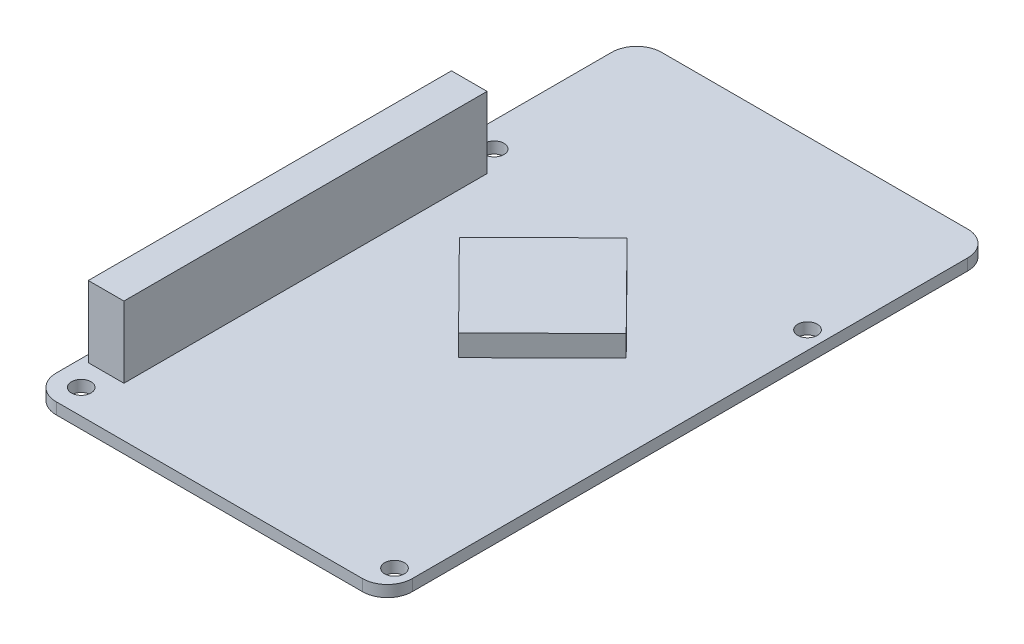
ISO-10303-21;
HEADER;
FILE_DESCRIPTION(('STEP AP214'),'2;1');
FILE_NAME('part.step','',(''),(''),'','','');
FILE_SCHEMA(('AUTOMOTIVE_DESIGN { 1 0 10303 214 1 1 1 1 }'));
ENDSEC;
DATA;
#1=APPLICATION_CONTEXT('core data for automotive mechanical design processes');
#2=APPLICATION_PROTOCOL_DEFINITION('international standard','automotive_design',2000,#1);
#3=PRODUCT_CONTEXT('',#1,'mechanical');
#4=PRODUCT('Part','Part','',(#3));
#5=PRODUCT_RELATED_PRODUCT_CATEGORY('part','',(#4));
#6=PRODUCT_DEFINITION_FORMATION('','',#4);
#7=PRODUCT_DEFINITION_CONTEXT('part definition',#1,'design');
#8=PRODUCT_DEFINITION('design','',#6,#7);
#9=PRODUCT_DEFINITION_SHAPE('','',#8);
#10=(LENGTH_UNIT() NAMED_UNIT(*) SI_UNIT(.MILLI.,.METRE.));
#11=(NAMED_UNIT(*) PLANE_ANGLE_UNIT() SI_UNIT($,.RADIAN.));
#12=(NAMED_UNIT(*) SI_UNIT($,.STERADIAN.) SOLID_ANGLE_UNIT());
#13=UNCERTAINTY_MEASURE_WITH_UNIT(LENGTH_MEASURE(1.E-05),#10,'distance_accuracy_value','');
#14=(GEOMETRIC_REPRESENTATION_CONTEXT(3) GLOBAL_UNCERTAINTY_ASSIGNED_CONTEXT((#13)) GLOBAL_UNIT_ASSIGNED_CONTEXT((#10,
#11,#12)) REPRESENTATION_CONTEXT('',''));
#15=CARTESIAN_POINT('',(0.,0.,0.));
#16=DIRECTION('',(0.,0.,1.));
#17=DIRECTION('',(1.,0.,0.));
#18=AXIS2_PLACEMENT_3D('',#15,#16,#17);
#19=CARTESIAN_POINT('',(0.,1.6,0.));
#20=DIRECTION('',(0.,-1.,0.));
#21=DIRECTION('',(0.,0.,-1.));
#22=AXIS2_PLACEMENT_3D('',#19,#20,#21);
#23=PLANE('',#22);
#24=DIRECTION('',(0.703505756727735,0.,0.710689559688995));
#25=VECTOR('',#24,1.);
#26=CARTESIAN_POINT('',(26.6484056100179,1.6,-57.0062030029917));
#27=LINE('',#26,#25);
#28=CARTESIAN_POINT('',(26.6484056100179,1.6,-57.0062030029917));
#29=VERTEX_POINT('',#28);
#30=CARTESIAN_POINT('',(38.2141461845933,1.6,-45.3223596259953));
#31=VERTEX_POINT('',#30);
#32=EDGE_CURVE('E55',#29,#31,#27,.T.);
#33=ORIENTED_EDGE('',*,*,#32,.T.);
#34=DIRECTION('',(-0.710689559688995,0.,0.703505756727735));
#35=VECTOR('',#34,1.);
#36=CARTESIAN_POINT('',(38.2141461845933,1.6,-45.3223596259953));
#37=LINE('',#36,#35);
#38=CARTESIAN_POINT('',(26.3838058780672,1.6,-33.61160294437));
#39=VERTEX_POINT('',#38);
#40=EDGE_CURVE('E188',#31,#39,#37,.T.);
#41=ORIENTED_EDGE('',*,*,#40,.T.);
#42=DIRECTION('',(0.703505756727735,0.,0.710689559688995));
#43=VECTOR('',#42,1.);
#44=CARTESIAN_POINT('',(14.8180653034918,1.6,-45.2954463213663));
#45=LINE('',#44,#43);
#46=CARTESIAN_POINT('',(14.8180653034918,1.6,-45.2954463213663));
#47=VERTEX_POINT('',#46);
#48=EDGE_CURVE('E170',#47,#39,#45,.T.);
#49=ORIENTED_EDGE('',*,*,#48,.F.);
#50=DIRECTION('',(-0.710689559688995,0.,0.703505756727735));
#51=VECTOR('',#50,1.);
#52=CARTESIAN_POINT('',(26.6484056100179,1.6,-57.0062030029917));
#53=LINE('',#52,#51);
#54=EDGE_CURVE('E60',#29,#47,#53,.T.);
#55=ORIENTED_EDGE('',*,*,#54,.F.);
#56=EDGE_LOOP('',(#33,#41,#49,#55));
#57=FACE_BOUND('',#56,.T.);
#58=CARTESIAN_POINT('',(3.5,1.6,-61.5));
#59=DIRECTION('',(0.,1.,0.));
#60=DIRECTION('',(0.,0.,1.));
#61=AXIS2_PLACEMENT_3D('',#58,#59,#60);
#62=CIRCLE('',#61,1.375);
#63=CARTESIAN_POINT('',(3.5,1.6,-60.125));
#64=VERTEX_POINT('',#63);
#65=EDGE_CURVE('E248',#64,#64,#62,.T.);
#66=ORIENTED_EDGE('',*,*,#65,.F.);
#67=EDGE_LOOP('',(#66));
#68=FACE_BOUND('',#67,.T.);
#69=CARTESIAN_POINT('',(47.5,1.6,-61.5));
#70=DIRECTION('',(0.,1.,0.));
#71=DIRECTION('',(0.,0.,1.));
#72=AXIS2_PLACEMENT_3D('',#69,#70,#71);
#73=CIRCLE('',#72,1.375);
#74=CARTESIAN_POINT('',(47.5,1.6,-60.125));
#75=VERTEX_POINT('',#74);
#76=EDGE_CURVE('E256',#75,#75,#73,.T.);
#77=ORIENTED_EDGE('',*,*,#76,.F.);
#78=EDGE_LOOP('',(#77));
#79=FACE_BOUND('',#78,.T.);
#80=CARTESIAN_POINT('',(47.5,1.6,-3.5));
#81=DIRECTION('',(0.,1.,0.));
#82=DIRECTION('',(0.,0.,1.));
#83=AXIS2_PLACEMENT_3D('',#80,#81,#82);
#84=CIRCLE('',#83,1.375);
#85=CARTESIAN_POINT('',(47.5,1.6,-2.125));
#86=VERTEX_POINT('',#85);
#87=EDGE_CURVE('E264',#86,#86,#84,.T.);
#88=ORIENTED_EDGE('',*,*,#87,.F.);
#89=EDGE_LOOP('',(#88));
#90=FACE_BOUND('',#89,.T.);
#91=CARTESIAN_POINT('',(3.5,1.6,-3.5));
#92=DIRECTION('',(0.,1.,0.));
#93=DIRECTION('',(0.,0.,1.));
#94=AXIS2_PLACEMENT_3D('',#91,#92,#93);
#95=CIRCLE('',#94,1.375);
#96=CARTESIAN_POINT('',(3.5,1.6,-2.125));
#97=VERTEX_POINT('',#96);
#98=EDGE_CURVE('E272',#97,#97,#95,.T.);
#99=ORIENTED_EDGE('',*,*,#98,.F.);
#100=EDGE_LOOP('',(#99));
#101=FACE_BOUND('',#100,.T.);
#102=DIRECTION('',(0.,0.,-1.));
#103=VECTOR('',#102,1.);
#104=CARTESIAN_POINT('',(50.,1.6,0.));
#105=LINE('',#104,#103);
#106=CARTESIAN_POINT('',(50.,1.6,-3.5));
#107=VERTEX_POINT('',#106);
#108=CARTESIAN_POINT('',(50.,1.6,-81.5));
#109=VERTEX_POINT('',#108);
#110=EDGE_CURVE('E289',#107,#109,#105,.T.);
#111=ORIENTED_EDGE('',*,*,#110,.T.);
#112=CARTESIAN_POINT('',(46.5,1.6,-81.5));
#113=DIRECTION('',(0.,-1.,0.));
#114=DIRECTION('',(0.,0.,-1.));
#115=AXIS2_PLACEMENT_3D('',#112,#113,#114);
#116=CIRCLE('',#115,3.5);
#117=CARTESIAN_POINT('',(46.5,1.6,-85.));
#118=VERTEX_POINT('',#117);
#119=EDGE_CURVE('E346',#109,#118,#116,.F.);
#120=ORIENTED_EDGE('',*,*,#119,.T.);
#121=DIRECTION('',(-1.,0.,0.));
#122=VECTOR('',#121,1.);
#123=CARTESIAN_POINT('',(0.,1.6,-85.));
#124=LINE('',#123,#122);
#125=CARTESIAN_POINT('',(3.5,1.6,-85.));
#126=VERTEX_POINT('',#125);
#127=EDGE_CURVE('E293',#118,#126,#124,.T.);
#128=ORIENTED_EDGE('',*,*,#127,.T.);
#129=CARTESIAN_POINT('',(3.5,1.6,-81.5));
#130=DIRECTION('',(0.,-1.,0.));
#131=DIRECTION('',(0.,0.,-1.));
#132=AXIS2_PLACEMENT_3D('',#129,#130,#131);
#133=CIRCLE('',#132,3.5);
#134=CARTESIAN_POINT('',(0.,1.6,-81.5));
#135=VERTEX_POINT('',#134);
#136=EDGE_CURVE('E343',#126,#135,#133,.F.);
#137=ORIENTED_EDGE('',*,*,#136,.T.);
#138=DIRECTION('',(0.,0.,1.));
#139=VECTOR('',#138,1.);
#140=CARTESIAN_POINT('',(0.,1.6,0.));
#141=LINE('',#140,#139);
#142=CARTESIAN_POINT('',(0.,1.6,-3.5));
#143=VERTEX_POINT('',#142);
#144=EDGE_CURVE('E280',#135,#143,#141,.T.);
#145=ORIENTED_EDGE('',*,*,#144,.T.);
#146=CARTESIAN_POINT('',(3.5,1.6,-3.5));
#147=DIRECTION('',(0.,-1.,0.));
#148=DIRECTION('',(0.,0.,-1.));
#149=AXIS2_PLACEMENT_3D('',#146,#147,#148);
#150=CIRCLE('',#149,3.5);
#151=CARTESIAN_POINT('',(3.5,1.6,0.));
#152=VERTEX_POINT('',#151);
#153=EDGE_CURVE('E340',#143,#152,#150,.F.);
#154=ORIENTED_EDGE('',*,*,#153,.T.);
#155=DIRECTION('',(1.,0.,0.));
#156=VECTOR('',#155,1.);
#157=CARTESIAN_POINT('',(0.,1.6,0.));
#158=LINE('',#157,#156);
#159=CARTESIAN_POINT('',(46.5,1.6,0.));
#160=VERTEX_POINT('',#159);
#161=EDGE_CURVE('E284',#152,#160,#158,.T.);
#162=ORIENTED_EDGE('',*,*,#161,.T.);
#163=CARTESIAN_POINT('',(46.5,1.6,-3.5));
#164=DIRECTION('',(0.,-1.,0.));
#165=DIRECTION('',(0.,0.,-1.));
#166=AXIS2_PLACEMENT_3D('',#163,#164,#165);
#167=CIRCLE('',#166,3.5);
#168=EDGE_CURVE('E337',#160,#107,#167,.F.);
#169=ORIENTED_EDGE('',*,*,#168,.T.);
#170=EDGE_LOOP('',(#111,#120,#128,#137,#145,#154,#162,#169));
#171=FACE_BOUND('',#170,.T.);
#172=DIRECTION('',(0.,0.,-1.));
#173=VECTOR('',#172,1.);
#174=CARTESIAN_POINT('',(6.,1.6,-7.00000000000001));
#175=LINE('',#174,#173);
#176=CARTESIAN_POINT('',(6.,1.6,-7.00000000000001));
#177=VERTEX_POINT('',#176);
#178=CARTESIAN_POINT('',(6.,1.6,-58.));
#179=VERTEX_POINT('',#178);
#180=EDGE_CURVE('E197',#177,#179,#175,.T.);
#181=ORIENTED_EDGE('',*,*,#180,.F.);
#182=DIRECTION('',(1.,0.,0.));
#183=VECTOR('',#182,1.);
#184=CARTESIAN_POINT('',(1.,1.6,-7.00000000000001));
#185=LINE('',#184,#183);
#186=CARTESIAN_POINT('',(1.,1.6,-7.00000000000001));
#187=VERTEX_POINT('',#186);
#188=EDGE_CURVE('E208',#187,#177,#185,.T.);
#189=ORIENTED_EDGE('',*,*,#188,.F.);
#190=DIRECTION('',(0.,0.,1.));
#191=VECTOR('',#190,1.);
#192=CARTESIAN_POINT('',(1.,1.6,-7.00000000000001));
#193=LINE('',#192,#191);
#194=CARTESIAN_POINT('',(1.,1.6,-58.));
#195=VERTEX_POINT('',#194);
#196=EDGE_CURVE('E225',#195,#187,#193,.T.);
#197=ORIENTED_EDGE('',*,*,#196,.F.);
#198=DIRECTION('',(-1.,0.,0.));
#199=VECTOR('',#198,1.);
#200=CARTESIAN_POINT('',(1.,1.6,-58.));
#201=LINE('',#200,#199);
#202=EDGE_CURVE('E221',#179,#195,#201,.T.);
#203=ORIENTED_EDGE('',*,*,#202,.F.);
#204=EDGE_LOOP('',(#181,#189,#197,#203));
#205=FACE_BOUND('',#204,.T.);
#206=ADVANCED_FACE('F39',(#57,#68,#79,#90,#101,#171,#205),#23,.F.);
#207=CARTESIAN_POINT('',(0.,0.,0.));
#208=DIRECTION('',(0.,-1.,0.));
#209=DIRECTION('',(0.,0.,-1.));
#210=AXIS2_PLACEMENT_3D('',#207,#208,#209);
#211=PLANE('',#210);
#212=CARTESIAN_POINT('',(47.5,0.,-61.5));
#213=DIRECTION('',(0.,1.,0.));
#214=DIRECTION('',(0.,0.,1.));
#215=AXIS2_PLACEMENT_3D('',#212,#213,#214);
#216=CIRCLE('',#215,1.375);
#217=CARTESIAN_POINT('',(47.5,0.,-60.125));
#218=VERTEX_POINT('',#217);
#219=EDGE_CURVE('E252',#218,#218,#216,.T.);
#220=ORIENTED_EDGE('',*,*,#219,.T.);
#221=EDGE_LOOP('',(#220));
#222=FACE_BOUND('',#221,.T.);
#223=CARTESIAN_POINT('',(3.5,0.,-3.5));
#224=DIRECTION('',(0.,1.,0.));
#225=DIRECTION('',(0.,0.,1.));
#226=AXIS2_PLACEMENT_3D('',#223,#224,#225);
#227=CIRCLE('',#226,1.375);
#228=CARTESIAN_POINT('',(3.5,0.,-2.125));
#229=VERTEX_POINT('',#228);
#230=EDGE_CURVE('E268',#229,#229,#227,.T.);
#231=ORIENTED_EDGE('',*,*,#230,.T.);
#232=EDGE_LOOP('',(#231));
#233=FACE_BOUND('',#232,.T.);
#234=DIRECTION('',(-1.,0.,0.));
#235=VECTOR('',#234,1.);
#236=CARTESIAN_POINT('',(0.,0.,-85.));
#237=LINE('',#236,#235);
#238=CARTESIAN_POINT('',(46.5,0.,-85.));
#239=VERTEX_POINT('',#238);
#240=CARTESIAN_POINT('',(3.5,0.,-85.));
#241=VERTEX_POINT('',#240);
#242=EDGE_CURVE('E285',#239,#241,#237,.T.);
#243=ORIENTED_EDGE('',*,*,#242,.F.);
#244=CARTESIAN_POINT('',(46.5,0.,-81.5));
#245=DIRECTION('',(0.,-1.,0.));
#246=DIRECTION('',(0.,0.,-1.));
#247=AXIS2_PLACEMENT_3D('',#244,#245,#246);
#248=CIRCLE('',#247,3.5);
#249=CARTESIAN_POINT('',(50.,0.,-81.5));
#250=VERTEX_POINT('',#249);
#251=EDGE_CURVE('E327',#239,#250,#248,.T.);
#252=ORIENTED_EDGE('',*,*,#251,.T.);
#253=DIRECTION('',(0.,0.,-1.));
#254=VECTOR('',#253,1.);
#255=CARTESIAN_POINT('',(50.,0.,0.));
#256=LINE('',#255,#254);
#257=CARTESIAN_POINT('',(50.,0.,-3.5));
#258=VERTEX_POINT('',#257);
#259=EDGE_CURVE('E305',#258,#250,#256,.T.);
#260=ORIENTED_EDGE('',*,*,#259,.F.);
#261=CARTESIAN_POINT('',(46.5,0.,-3.5));
#262=DIRECTION('',(0.,-1.,0.));
#263=DIRECTION('',(0.,0.,-1.));
#264=AXIS2_PLACEMENT_3D('',#261,#262,#263);
#265=CIRCLE('',#264,3.5);
#266=CARTESIAN_POINT('',(46.5,0.,0.));
#267=VERTEX_POINT('',#266);
#268=EDGE_CURVE('E318',#258,#267,#265,.T.);
#269=ORIENTED_EDGE('',*,*,#268,.T.);
#270=DIRECTION('',(1.,0.,0.));
#271=VECTOR('',#270,1.);
#272=CARTESIAN_POINT('',(0.,0.,0.));
#273=LINE('',#272,#271);
#274=CARTESIAN_POINT('',(3.5,0.,0.));
#275=VERTEX_POINT('',#274);
#276=EDGE_CURVE('E301',#275,#267,#273,.T.);
#277=ORIENTED_EDGE('',*,*,#276,.F.);
#278=CARTESIAN_POINT('',(3.5,0.,-3.5));
#279=DIRECTION('',(0.,-1.,0.));
#280=DIRECTION('',(0.,0.,-1.));
#281=AXIS2_PLACEMENT_3D('',#278,#279,#280);
#282=CIRCLE('',#281,3.5);
#283=CARTESIAN_POINT('',(0.,0.,-3.5));
#284=VERTEX_POINT('',#283);
#285=EDGE_CURVE('E321',#275,#284,#282,.T.);
#286=ORIENTED_EDGE('',*,*,#285,.T.);
#287=DIRECTION('',(0.,0.,1.));
#288=VECTOR('',#287,1.);
#289=CARTESIAN_POINT('',(0.,0.,0.));
#290=LINE('',#289,#288);
#291=CARTESIAN_POINT('',(0.,0.,-81.5));
#292=VERTEX_POINT('',#291);
#293=EDGE_CURVE('E276',#292,#284,#290,.T.);
#294=ORIENTED_EDGE('',*,*,#293,.F.);
#295=CARTESIAN_POINT('',(3.5,0.,-81.5));
#296=DIRECTION('',(0.,-1.,0.));
#297=DIRECTION('',(0.,0.,-1.));
#298=AXIS2_PLACEMENT_3D('',#295,#296,#297);
#299=CIRCLE('',#298,3.5);
#300=EDGE_CURVE('E324',#292,#241,#299,.T.);
#301=ORIENTED_EDGE('',*,*,#300,.T.);
#302=EDGE_LOOP('',(#243,#252,#260,#269,#277,#286,#294,#301));
#303=FACE_BOUND('',#302,.T.);
#304=CARTESIAN_POINT('',(47.5,0.,-3.5));
#305=DIRECTION('',(0.,1.,0.));
#306=DIRECTION('',(0.,0.,1.));
#307=AXIS2_PLACEMENT_3D('',#304,#305,#306);
#308=CIRCLE('',#307,1.375);
#309=CARTESIAN_POINT('',(47.5,0.,-2.125));
#310=VERTEX_POINT('',#309);
#311=EDGE_CURVE('E260',#310,#310,#308,.T.);
#312=ORIENTED_EDGE('',*,*,#311,.T.);
#313=EDGE_LOOP('',(#312));
#314=FACE_BOUND('',#313,.T.);
#315=CARTESIAN_POINT('',(3.5,0.,-61.5));
#316=DIRECTION('',(0.,1.,0.));
#317=DIRECTION('',(0.,0.,1.));
#318=AXIS2_PLACEMENT_3D('',#315,#316,#317);
#319=CIRCLE('',#318,1.375);
#320=CARTESIAN_POINT('',(3.5,0.,-60.125));
#321=VERTEX_POINT('',#320);
#322=EDGE_CURVE('E247',#321,#321,#319,.T.);
#323=ORIENTED_EDGE('',*,*,#322,.T.);
#324=EDGE_LOOP('',(#323));
#325=FACE_BOUND('',#324,.T.);
#326=ADVANCED_FACE('F375',(#222,#233,#303,#314,#325),#211,.T.);
#327=CARTESIAN_POINT('',(0.,1.6,0.));
#328=DIRECTION('',(1.,0.,0.));
#329=DIRECTION('',(0.,0.,-1.));
#330=AXIS2_PLACEMENT_3D('',#327,#328,#329);
#331=PLANE('',#330);
#332=ORIENTED_EDGE('',*,*,#144,.F.);
#333=DIRECTION('',(0.,-1.,0.));
#334=VECTOR('',#333,1.);
#335=CARTESIAN_POINT('',(0.,1.6,-81.5));
#336=LINE('',#335,#334);
#337=EDGE_CURVE('E352',#135,#292,#336,.T.);
#338=ORIENTED_EDGE('',*,*,#337,.T.);
#339=ORIENTED_EDGE('',*,*,#293,.T.);
#340=DIRECTION('',(0.,-1.,0.));
#341=VECTOR('',#340,1.);
#342=CARTESIAN_POINT('',(0.,1.6,-3.5));
#343=LINE('',#342,#341);
#344=EDGE_CURVE('E349',#284,#143,#343,.F.);
#345=ORIENTED_EDGE('',*,*,#344,.T.);
#346=EDGE_LOOP('',(#332,#338,#339,#345));
#347=FACE_BOUND('',#346,.T.);
#348=ADVANCED_FACE('F392',(#347),#331,.F.);
#349=CARTESIAN_POINT('',(0.,1.6,0.));
#350=DIRECTION('',(0.,0.,-1.));
#351=DIRECTION('',(-1.,0.,0.));
#352=AXIS2_PLACEMENT_3D('',#349,#350,#351);
#353=PLANE('',#352);
#354=ORIENTED_EDGE('',*,*,#161,.F.);
#355=DIRECTION('',(0.,-1.,0.));
#356=VECTOR('',#355,1.);
#357=CARTESIAN_POINT('',(3.5,1.6,0.));
#358=LINE('',#357,#356);
#359=EDGE_CURVE('E11',#152,#275,#358,.T.);
#360=ORIENTED_EDGE('',*,*,#359,.T.);
#361=ORIENTED_EDGE('',*,*,#276,.T.);
#362=DIRECTION('',(0.,-1.,0.));
#363=VECTOR('',#362,1.);
#364=CARTESIAN_POINT('',(46.5,1.6,0.));
#365=LINE('',#364,#363);
#366=EDGE_CURVE('E48',#267,#160,#365,.F.);
#367=ORIENTED_EDGE('',*,*,#366,.T.);
#368=EDGE_LOOP('',(#354,#360,#361,#367));
#369=FACE_BOUND('',#368,.T.);
#370=ADVANCED_FACE('F359',(#369),#353,.F.);
#371=CARTESIAN_POINT('',(50.,1.6,0.));
#372=DIRECTION('',(-1.,0.,0.));
#373=DIRECTION('',(0.,0.,1.));
#374=AXIS2_PLACEMENT_3D('',#371,#372,#373);
#375=PLANE('',#374);
#376=ORIENTED_EDGE('',*,*,#259,.T.);
#377=DIRECTION('',(0.,-1.,0.));
#378=VECTOR('',#377,1.);
#379=CARTESIAN_POINT('',(50.,1.6,-81.5));
#380=LINE('',#379,#378);
#381=EDGE_CURVE('E334',#250,#109,#380,.F.);
#382=ORIENTED_EDGE('',*,*,#381,.T.);
#383=ORIENTED_EDGE('',*,*,#110,.F.);
#384=DIRECTION('',(0.,-1.,0.));
#385=VECTOR('',#384,1.);
#386=CARTESIAN_POINT('',(50.,1.6,-3.5));
#387=LINE('',#386,#385);
#388=EDGE_CURVE('E330',#107,#258,#387,.T.);
#389=ORIENTED_EDGE('',*,*,#388,.T.);
#390=EDGE_LOOP('',(#376,#382,#383,#389));
#391=FACE_BOUND('',#390,.T.);
#392=ADVANCED_FACE('F371',(#391),#375,.F.);
#393=CARTESIAN_POINT('',(0.,1.6,-85.));
#394=DIRECTION('',(0.,0.,1.));
#395=DIRECTION('',(1.,0.,0.));
#396=AXIS2_PLACEMENT_3D('',#393,#394,#395);
#397=PLANE('',#396);
#398=ORIENTED_EDGE('',*,*,#127,.F.);
#399=DIRECTION('',(0.,-1.,0.));
#400=VECTOR('',#399,1.);
#401=CARTESIAN_POINT('',(46.5,1.6,-85.));
#402=LINE('',#401,#400);
#403=EDGE_CURVE('E314',#118,#239,#402,.T.);
#404=ORIENTED_EDGE('',*,*,#403,.T.);
#405=ORIENTED_EDGE('',*,*,#242,.T.);
#406=DIRECTION('',(0.,-1.,0.));
#407=VECTOR('',#406,1.);
#408=CARTESIAN_POINT('',(3.5,1.6,-85.));
#409=LINE('',#408,#407);
#410=EDGE_CURVE('E297',#241,#126,#409,.F.);
#411=ORIENTED_EDGE('',*,*,#410,.T.);
#412=EDGE_LOOP('',(#398,#404,#405,#411));
#413=FACE_BOUND('',#412,.T.);
#414=ADVANCED_FACE('F383',(#413),#397,.F.);
#415=CARTESIAN_POINT('',(3.5,1.6,-3.5));
#416=DIRECTION('',(0.,-1.,0.));
#417=DIRECTION('',(0.,0.,-1.));
#418=AXIS2_PLACEMENT_3D('',#415,#416,#417);
#419=CYLINDRICAL_SURFACE('',#418,1.375);
#420=ORIENTED_EDGE('',*,*,#98,.T.);
#421=EDGE_LOOP('',(#420));
#422=FACE_BOUND('',#421,.T.);
#423=ORIENTED_EDGE('',*,*,#230,.F.);
#424=EDGE_LOOP('',(#423));
#425=FACE_BOUND('',#424,.T.);
#426=ADVANCED_FACE('F412',(#422,#425),#419,.F.);
#427=CARTESIAN_POINT('',(47.5,1.6,-3.5));
#428=DIRECTION('',(0.,-1.,0.));
#429=DIRECTION('',(0.,0.,-1.));
#430=AXIS2_PLACEMENT_3D('',#427,#428,#429);
#431=CYLINDRICAL_SURFACE('',#430,1.375);
#432=ORIENTED_EDGE('',*,*,#87,.T.);
#433=EDGE_LOOP('',(#432));
#434=FACE_BOUND('',#433,.T.);
#435=ORIENTED_EDGE('',*,*,#311,.F.);
#436=EDGE_LOOP('',(#435));
#437=FACE_BOUND('',#436,.T.);
#438=ADVANCED_FACE('F434',(#434,#437),#431,.F.);
#439=CARTESIAN_POINT('',(47.5,1.6,-61.5));
#440=DIRECTION('',(0.,-1.,0.));
#441=DIRECTION('',(0.,0.,-1.));
#442=AXIS2_PLACEMENT_3D('',#439,#440,#441);
#443=CYLINDRICAL_SURFACE('',#442,1.375);
#444=ORIENTED_EDGE('',*,*,#76,.T.);
#445=EDGE_LOOP('',(#444));
#446=FACE_BOUND('',#445,.T.);
#447=ORIENTED_EDGE('',*,*,#219,.F.);
#448=EDGE_LOOP('',(#447));
#449=FACE_BOUND('',#448,.T.);
#450=ADVANCED_FACE('F428',(#446,#449),#443,.F.);
#451=CARTESIAN_POINT('',(3.5,1.6,-61.5));
#452=DIRECTION('',(0.,-1.,0.));
#453=DIRECTION('',(0.,0.,-1.));
#454=AXIS2_PLACEMENT_3D('',#451,#452,#453);
#455=CYLINDRICAL_SURFACE('',#454,1.375);
#456=ORIENTED_EDGE('',*,*,#65,.T.);
#457=EDGE_LOOP('',(#456));
#458=FACE_BOUND('',#457,.T.);
#459=ORIENTED_EDGE('',*,*,#322,.F.);
#460=EDGE_LOOP('',(#459));
#461=FACE_BOUND('',#460,.T.);
#462=ADVANCED_FACE('F424',(#458,#461),#455,.F.);
#463=CARTESIAN_POINT('',(46.5,1.6,-81.5));
#464=DIRECTION('',(0.,-1.,0.));
#465=DIRECTION('',(0.,0.,-1.));
#466=AXIS2_PLACEMENT_3D('',#463,#464,#465);
#467=CYLINDRICAL_SURFACE('',#466,3.5);
#468=ORIENTED_EDGE('',*,*,#119,.F.);
#469=ORIENTED_EDGE('',*,*,#381,.F.);
#470=ORIENTED_EDGE('',*,*,#251,.F.);
#471=ORIENTED_EDGE('',*,*,#403,.F.);
#472=EDGE_LOOP('',(#468,#469,#470,#471));
#473=FACE_BOUND('',#472,.T.);
#474=ADVANCED_FACE('F380',(#473),#467,.T.);
#475=CARTESIAN_POINT('',(3.5,1.6,-81.5));
#476=DIRECTION('',(0.,-1.,0.));
#477=DIRECTION('',(0.,0.,-1.));
#478=AXIS2_PLACEMENT_3D('',#475,#476,#477);
#479=CYLINDRICAL_SURFACE('',#478,3.5);
#480=ORIENTED_EDGE('',*,*,#136,.F.);
#481=ORIENTED_EDGE('',*,*,#410,.F.);
#482=ORIENTED_EDGE('',*,*,#300,.F.);
#483=ORIENTED_EDGE('',*,*,#337,.F.);
#484=EDGE_LOOP('',(#480,#481,#482,#483));
#485=FACE_BOUND('',#484,.T.);
#486=ADVANCED_FACE('F389',(#485),#479,.T.);
#487=CARTESIAN_POINT('',(3.5,1.6,-3.5));
#488=DIRECTION('',(0.,-1.,0.));
#489=DIRECTION('',(0.,0.,-1.));
#490=AXIS2_PLACEMENT_3D('',#487,#488,#489);
#491=CYLINDRICAL_SURFACE('',#490,3.5);
#492=ORIENTED_EDGE('',*,*,#153,.F.);
#493=ORIENTED_EDGE('',*,*,#344,.F.);
#494=ORIENTED_EDGE('',*,*,#285,.F.);
#495=ORIENTED_EDGE('',*,*,#359,.F.);
#496=EDGE_LOOP('',(#492,#493,#494,#495));
#497=FACE_BOUND('',#496,.T.);
#498=ADVANCED_FACE('F395',(#497),#491,.T.);
#499=CARTESIAN_POINT('',(46.5,1.6,-3.5));
#500=DIRECTION('',(0.,-1.,0.));
#501=DIRECTION('',(0.,0.,-1.));
#502=AXIS2_PLACEMENT_3D('',#499,#500,#501);
#503=CYLINDRICAL_SURFACE('',#502,3.5);
#504=ORIENTED_EDGE('',*,*,#168,.F.);
#505=ORIENTED_EDGE('',*,*,#366,.F.);
#506=ORIENTED_EDGE('',*,*,#268,.F.);
#507=ORIENTED_EDGE('',*,*,#388,.F.);
#508=EDGE_LOOP('',(#504,#505,#506,#507));
#509=FACE_BOUND('',#508,.T.);
#510=ADVANCED_FACE('F41',(#509),#503,.T.);
#511=CARTESIAN_POINT('',(6.,11.6,-7.00000000000001));
#512=DIRECTION('',(-1.,0.,0.));
#513=DIRECTION('',(0.,0.,1.));
#514=AXIS2_PLACEMENT_3D('',#511,#512,#513);
#515=PLANE('',#514);
#516=ORIENTED_EDGE('',*,*,#180,.T.);
#517=DIRECTION('',(0.,-1.,0.));
#518=VECTOR('',#517,1.);
#519=CARTESIAN_POINT('',(6.,11.6,-58.));
#520=LINE('',#519,#518);
#521=CARTESIAN_POINT('',(6.,11.6,-58.));
#522=VERTEX_POINT('',#521);
#523=EDGE_CURVE('E243',#522,#179,#520,.T.);
#524=ORIENTED_EDGE('',*,*,#523,.F.);
#525=DIRECTION('',(0.,0.,-1.));
#526=VECTOR('',#525,1.);
#527=CARTESIAN_POINT('',(6.,11.6,-7.00000000000001));
#528=LINE('',#527,#526);
#529=CARTESIAN_POINT('',(6.,11.6,-7.00000000000001));
#530=VERTEX_POINT('',#529);
#531=EDGE_CURVE('E203',#530,#522,#528,.T.);
#532=ORIENTED_EDGE('',*,*,#531,.F.);
#533=DIRECTION('',(0.,-1.,0.));
#534=VECTOR('',#533,1.);
#535=CARTESIAN_POINT('',(6.,11.6,-7.00000000000001));
#536=LINE('',#535,#534);
#537=EDGE_CURVE('E217',#530,#177,#536,.T.);
#538=ORIENTED_EDGE('',*,*,#537,.T.);
#539=EDGE_LOOP('',(#516,#524,#532,#538));
#540=FACE_BOUND('',#539,.T.);
#541=ADVANCED_FACE('F401',(#540),#515,.F.);
#542=CARTESIAN_POINT('',(1.,11.6,-58.));
#543=DIRECTION('',(0.,0.,1.));
#544=DIRECTION('',(1.,0.,0.));
#545=AXIS2_PLACEMENT_3D('',#542,#543,#544);
#546=PLANE('',#545);
#547=ORIENTED_EDGE('',*,*,#202,.T.);
#548=DIRECTION('',(0.,-1.,0.));
#549=VECTOR('',#548,1.);
#550=CARTESIAN_POINT('',(1.,11.6,-58.));
#551=LINE('',#550,#549);
#552=CARTESIAN_POINT('',(1.,11.6,-58.));
#553=VERTEX_POINT('',#552);
#554=EDGE_CURVE('E239',#553,#195,#551,.T.);
#555=ORIENTED_EDGE('',*,*,#554,.F.);
#556=DIRECTION('',(-1.,0.,0.));
#557=VECTOR('',#556,1.);
#558=CARTESIAN_POINT('',(1.,11.6,-58.));
#559=LINE('',#558,#557);
#560=EDGE_CURVE('E207',#522,#553,#559,.T.);
#561=ORIENTED_EDGE('',*,*,#560,.F.);
#562=ORIENTED_EDGE('',*,*,#523,.T.);
#563=EDGE_LOOP('',(#547,#555,#561,#562));
#564=FACE_BOUND('',#563,.T.);
#565=ADVANCED_FACE('F537',(#564),#546,.F.);
#566=CARTESIAN_POINT('',(1.,11.6,-7.00000000000001));
#567=DIRECTION('',(1.,0.,0.));
#568=DIRECTION('',(0.,0.,-1.));
#569=AXIS2_PLACEMENT_3D('',#566,#567,#568);
#570=PLANE('',#569);
#571=ORIENTED_EDGE('',*,*,#196,.T.);
#572=DIRECTION('',(0.,-1.,0.));
#573=VECTOR('',#572,1.);
#574=CARTESIAN_POINT('',(1.,11.6,-7.00000000000001));
#575=LINE('',#574,#573);
#576=CARTESIAN_POINT('',(1.,11.6,-7.00000000000001));
#577=VERTEX_POINT('',#576);
#578=EDGE_CURVE('E235',#577,#187,#575,.T.);
#579=ORIENTED_EDGE('',*,*,#578,.F.);
#580=DIRECTION('',(0.,0.,1.));
#581=VECTOR('',#580,1.);
#582=CARTESIAN_POINT('',(1.,11.6,-7.00000000000001));
#583=LINE('',#582,#581);
#584=EDGE_CURVE('E211',#553,#577,#583,.T.);
#585=ORIENTED_EDGE('',*,*,#584,.F.);
#586=ORIENTED_EDGE('',*,*,#554,.T.);
#587=EDGE_LOOP('',(#571,#579,#585,#586));
#588=FACE_BOUND('',#587,.T.);
#589=ADVANCED_FACE('F545',(#588),#570,.F.);
#590=CARTESIAN_POINT('',(1.,11.6,-7.00000000000001));
#591=DIRECTION('',(0.,0.,-1.));
#592=DIRECTION('',(-1.,0.,0.));
#593=AXIS2_PLACEMENT_3D('',#590,#591,#592);
#594=PLANE('',#593);
#595=ORIENTED_EDGE('',*,*,#188,.T.);
#596=ORIENTED_EDGE('',*,*,#537,.F.);
#597=DIRECTION('',(1.,0.,0.));
#598=VECTOR('',#597,1.);
#599=CARTESIAN_POINT('',(1.,11.6,-7.00000000000001));
#600=LINE('',#599,#598);
#601=EDGE_CURVE('E214',#577,#530,#600,.T.);
#602=ORIENTED_EDGE('',*,*,#601,.F.);
#603=ORIENTED_EDGE('',*,*,#578,.T.);
#604=EDGE_LOOP('',(#595,#596,#602,#603));
#605=FACE_BOUND('',#604,.T.);
#606=ADVANCED_FACE('F553',(#605),#594,.F.);
#607=CARTESIAN_POINT('',(0.,11.6,0.));
#608=DIRECTION('',(0.,-1.,0.));
#609=DIRECTION('',(0.,0.,-1.));
#610=AXIS2_PLACEMENT_3D('',#607,#608,#609);
#611=PLANE('',#610);
#612=ORIENTED_EDGE('',*,*,#531,.T.);
#613=ORIENTED_EDGE('',*,*,#560,.T.);
#614=ORIENTED_EDGE('',*,*,#584,.T.);
#615=ORIENTED_EDGE('',*,*,#601,.T.);
#616=EDGE_LOOP('',(#612,#613,#614,#615));
#617=FACE_BOUND('',#616,.T.);
#618=ADVANCED_FACE('F562',(#617),#611,.F.);
#619=CARTESIAN_POINT('',(38.2141461845933,4.6,-45.3223596259953));
#620=DIRECTION('',(0.703505756727734,0.,0.710689559688995));
#621=DIRECTION('',(0.710689559688995,0.,-0.703505756727735));
#622=AXIS2_PLACEMENT_3D('',#619,#620,#621);
#623=PLANE('',#622);
#624=ORIENTED_EDGE('',*,*,#40,.F.);
#625=DIRECTION('',(0.,-1.,0.));
#626=VECTOR('',#625,1.);
#627=CARTESIAN_POINT('',(38.2141461845933,4.6,-45.3223596259953));
#628=LINE('',#627,#626);
#629=CARTESIAN_POINT('',(38.2141461845933,4.6,-45.3223596259953));
#630=VERTEX_POINT('',#629);
#631=EDGE_CURVE('E178',#630,#31,#628,.T.);
#632=ORIENTED_EDGE('',*,*,#631,.F.);
#633=DIRECTION('',(-0.710689559688995,0.,0.703505756727735));
#634=VECTOR('',#633,1.);
#635=CARTESIAN_POINT('',(38.2141461845933,4.6,-45.3223596259953));
#636=LINE('',#635,#634);
#637=CARTESIAN_POINT('',(26.3838058780672,4.6,-33.61160294437));
#638=VERTEX_POINT('',#637);
#639=EDGE_CURVE('E157',#630,#638,#636,.T.);
#640=ORIENTED_EDGE('',*,*,#639,.T.);
#641=DIRECTION('',(0.,-1.,0.));
#642=VECTOR('',#641,1.);
#643=CARTESIAN_POINT('',(26.3838058780672,4.6,-33.61160294437));
#644=LINE('',#643,#642);
#645=EDGE_CURVE('E168',#638,#39,#644,.T.);
#646=ORIENTED_EDGE('',*,*,#645,.T.);
#647=EDGE_LOOP('',(#624,#632,#640,#646));
#648=FACE_BOUND('',#647,.T.);
#649=ADVANCED_FACE('F177',(#648),#623,.T.);
#650=CARTESIAN_POINT('',(26.6484056100179,4.6,-57.0062030029917));
#651=DIRECTION('',(0.710689559688995,0.,-0.703505756727735));
#652=DIRECTION('',(-0.703505756727735,0.,-0.710689559688995));
#653=AXIS2_PLACEMENT_3D('',#650,#651,#652);
#654=PLANE('',#653);
#655=ORIENTED_EDGE('',*,*,#32,.F.);
#656=DIRECTION('',(0.,-1.,0.));
#657=VECTOR('',#656,1.);
#658=CARTESIAN_POINT('',(26.6484056100179,4.6,-57.0062030029917));
#659=LINE('',#658,#657);
#660=CARTESIAN_POINT('',(26.6484056100179,4.6,-57.0062030029917));
#661=VERTEX_POINT('',#660);
#662=EDGE_CURVE('E198',#661,#29,#659,.T.);
#663=ORIENTED_EDGE('',*,*,#662,.F.);
#664=DIRECTION('',(0.703505756727735,0.,0.710689559688995));
#665=VECTOR('',#664,1.);
#666=CARTESIAN_POINT('',(26.6484056100179,4.6,-57.0062030029917));
#667=LINE('',#666,#665);
#668=EDGE_CURVE('E175',#661,#630,#667,.T.);
#669=ORIENTED_EDGE('',*,*,#668,.T.);
#670=ORIENTED_EDGE('',*,*,#631,.T.);
#671=EDGE_LOOP('',(#655,#663,#669,#670));
#672=FACE_BOUND('',#671,.T.);
#673=ADVANCED_FACE('F577',(#672),#654,.T.);
#674=CARTESIAN_POINT('',(26.6484056100179,4.6,-57.0062030029917));
#675=DIRECTION('',(0.703505756727735,0.,0.710689559688995));
#676=DIRECTION('',(0.710689559688995,0.,-0.703505756727735));
#677=AXIS2_PLACEMENT_3D('',#674,#675,#676);
#678=PLANE('',#677);
#679=ORIENTED_EDGE('',*,*,#54,.T.);
#680=DIRECTION('',(0.,-1.,0.));
#681=VECTOR('',#680,1.);
#682=CARTESIAN_POINT('',(14.8180653034918,4.6,-45.2954463213663));
#683=LINE('',#682,#681);
#684=CARTESIAN_POINT('',(14.8180653034918,4.6,-45.2954463213663));
#685=VERTEX_POINT('',#684);
#686=EDGE_CURVE('E174',#685,#47,#683,.T.);
#687=ORIENTED_EDGE('',*,*,#686,.F.);
#688=DIRECTION('',(-0.710689559688995,0.,0.703505756727735));
#689=VECTOR('',#688,1.);
#690=CARTESIAN_POINT('',(26.6484056100179,4.6,-57.0062030029917));
#691=LINE('',#690,#689);
#692=EDGE_CURVE('E160',#661,#685,#691,.T.);
#693=ORIENTED_EDGE('',*,*,#692,.F.);
#694=ORIENTED_EDGE('',*,*,#662,.T.);
#695=EDGE_LOOP('',(#679,#687,#693,#694));
#696=FACE_BOUND('',#695,.T.);
#697=ADVANCED_FACE('F585',(#696),#678,.F.);
#698=CARTESIAN_POINT('',(14.8180653034918,4.6,-45.2954463213663));
#699=DIRECTION('',(0.710689559688995,0.,-0.703505756727735));
#700=DIRECTION('',(-0.703505756727735,0.,-0.710689559688995));
#701=AXIS2_PLACEMENT_3D('',#698,#699,#700);
#702=PLANE('',#701);
#703=ORIENTED_EDGE('',*,*,#48,.T.);
#704=ORIENTED_EDGE('',*,*,#645,.F.);
#705=DIRECTION('',(0.703505756727735,0.,0.710689559688995));
#706=VECTOR('',#705,1.);
#707=CARTESIAN_POINT('',(14.8180653034918,4.6,-45.2954463213663));
#708=LINE('',#707,#706);
#709=EDGE_CURVE('E152',#685,#638,#708,.T.);
#710=ORIENTED_EDGE('',*,*,#709,.F.);
#711=ORIENTED_EDGE('',*,*,#686,.T.);
#712=EDGE_LOOP('',(#703,#704,#710,#711));
#713=FACE_BOUND('',#712,.T.);
#714=ADVANCED_FACE('F169',(#713),#702,.F.);
#715=CARTESIAN_POINT('',(0.,4.6,0.));
#716=DIRECTION('',(0.,1.,0.));
#717=DIRECTION('',(0.,0.,1.));
#718=AXIS2_PLACEMENT_3D('',#715,#716,#717);
#719=PLANE('',#718);
#720=ORIENTED_EDGE('',*,*,#639,.F.);
#721=ORIENTED_EDGE('',*,*,#668,.F.);
#722=ORIENTED_EDGE('',*,*,#692,.T.);
#723=ORIENTED_EDGE('',*,*,#709,.T.);
#724=EDGE_LOOP('',(#720,#721,#722,#723));
#725=FACE_BOUND('',#724,.T.);
#726=ADVANCED_FACE('F154',(#725),#719,.T.);
#727=CLOSED_SHELL('',(#206,#326,#348,#370,#392,#414,#426,#438,#450,#462,#474,#486,#498,#510,
#541,#565,#589,#606,#618,#649,#673,#697,#714,#726));
#728=MANIFOLD_SOLID_BREP('B2',#727);
#729=ADVANCED_BREP_SHAPE_REPRESENTATION('',(#18,#728),#14);
#730=SHAPE_DEFINITION_REPRESENTATION(#9,#729);
ENDSEC;
END-ISO-10303-21;
